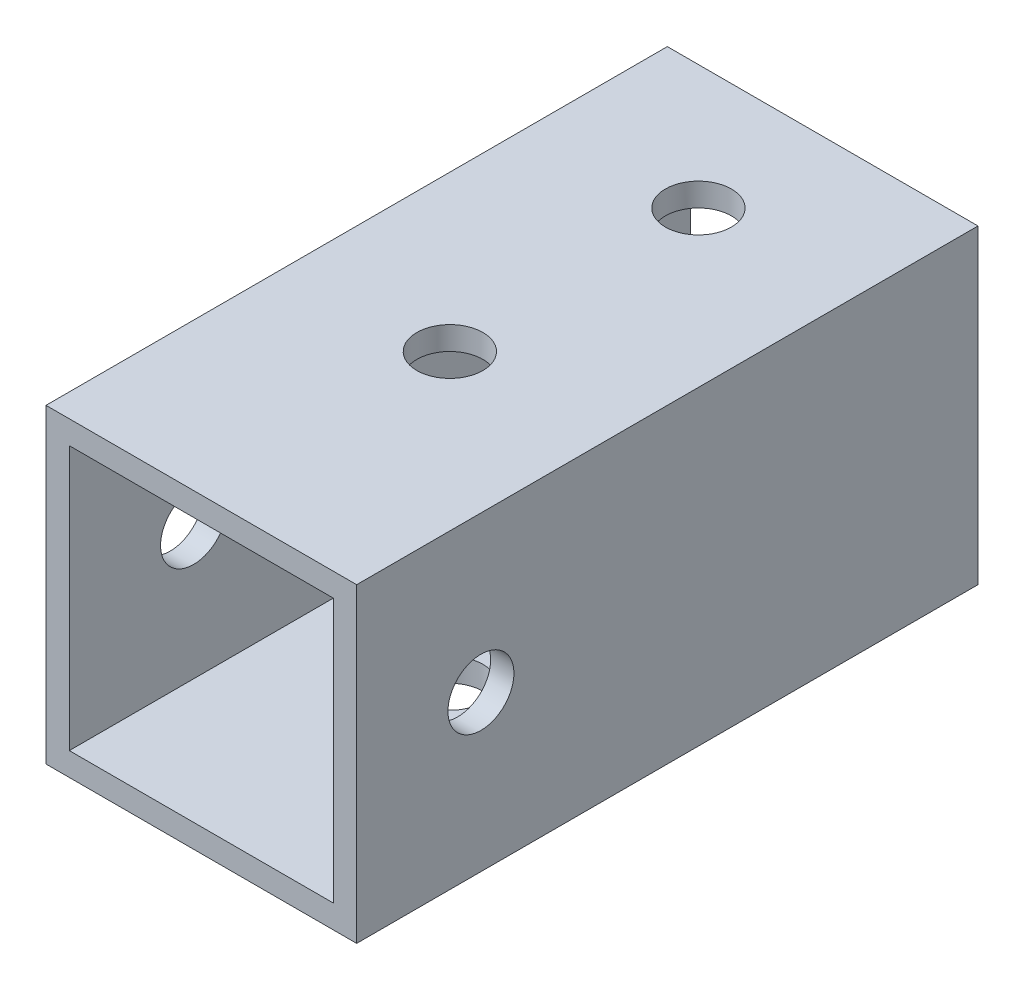
ISO-10303-21;
HEADER;
FILE_DESCRIPTION(('STEP AP214'),'2;1');
FILE_NAME('part.step','',(''),(''),'','','');
FILE_SCHEMA(('AUTOMOTIVE_DESIGN { 1 0 10303 214 1 1 1 1 }'));
ENDSEC;
DATA;
#1=APPLICATION_CONTEXT('core data for automotive mechanical design processes');
#2=APPLICATION_PROTOCOL_DEFINITION('international standard','automotive_design',2000,#1);
#3=PRODUCT_CONTEXT('',#1,'mechanical');
#4=PRODUCT('Part','Part','',(#3));
#5=PRODUCT_RELATED_PRODUCT_CATEGORY('part','',(#4));
#6=PRODUCT_DEFINITION_FORMATION('','',#4);
#7=PRODUCT_DEFINITION_CONTEXT('part definition',#1,'design');
#8=PRODUCT_DEFINITION('design','',#6,#7);
#9=PRODUCT_DEFINITION_SHAPE('','',#8);
#10=(LENGTH_UNIT() NAMED_UNIT(*) SI_UNIT(.MILLI.,.METRE.));
#11=(NAMED_UNIT(*) PLANE_ANGLE_UNIT() SI_UNIT($,.RADIAN.));
#12=(NAMED_UNIT(*) SI_UNIT($,.STERADIAN.) SOLID_ANGLE_UNIT());
#13=UNCERTAINTY_MEASURE_WITH_UNIT(LENGTH_MEASURE(1.E-05),#10,'distance_accuracy_value','');
#14=(GEOMETRIC_REPRESENTATION_CONTEXT(3) GLOBAL_UNCERTAINTY_ASSIGNED_CONTEXT((#13)) GLOBAL_UNIT_ASSIGNED_CONTEXT((#10,
#11,#12)) REPRESENTATION_CONTEXT('',''));
#15=CARTESIAN_POINT('',(0.,0.,0.));
#16=DIRECTION('',(0.,0.,1.));
#17=DIRECTION('',(1.,0.,0.));
#18=AXIS2_PLACEMENT_3D('',#15,#16,#17);
#19=CARTESIAN_POINT('',(10.,-9.99999999999999,-40.));
#20=DIRECTION('',(1.,0.,0.));
#21=DIRECTION('',(0.,0.,-1.));
#22=AXIS2_PLACEMENT_3D('',#19,#20,#21);
#23=PLANE('',#22);
#24=CARTESIAN_POINT('',(10.,0.,-8.));
#25=DIRECTION('',(1.,0.,0.));
#26=DIRECTION('',(0.,0.,-1.));
#27=AXIS2_PLACEMENT_3D('',#24,#25,#26);
#28=CIRCLE('',#27,2.125);
#29=CARTESIAN_POINT('',(10.,0.,-10.125));
#30=VERTEX_POINT('',#29);
#31=EDGE_CURVE('E201',#30,#30,#28,.T.);
#32=ORIENTED_EDGE('',*,*,#31,.F.);
#33=EDGE_LOOP('',(#32));
#34=FACE_BOUND('',#33,.T.);
#35=DIRECTION('',(0.,1.,0.));
#36=VECTOR('',#35,1.);
#37=CARTESIAN_POINT('',(10.,-9.99999999999999,0.));
#38=LINE('',#37,#36);
#39=CARTESIAN_POINT('',(10.,-9.99999999999999,0.));
#40=VERTEX_POINT('',#39);
#41=CARTESIAN_POINT('',(10.,10.,0.));
#42=VERTEX_POINT('',#41);
#43=EDGE_CURVE('E142',#40,#42,#38,.T.);
#44=ORIENTED_EDGE('',*,*,#43,.F.);
#45=DIRECTION('',(0.,0.,1.));
#46=VECTOR('',#45,1.);
#47=CARTESIAN_POINT('',(10.,-9.99999999999999,-40.));
#48=LINE('',#47,#46);
#49=CARTESIAN_POINT('',(10.,-9.99999999999999,-40.));
#50=VERTEX_POINT('',#49);
#51=EDGE_CURVE('E11',#50,#40,#48,.T.);
#52=ORIENTED_EDGE('',*,*,#51,.F.);
#53=DIRECTION('',(0.,1.,0.));
#54=VECTOR('',#53,1.);
#55=CARTESIAN_POINT('',(10.,-9.99999999999999,-40.));
#56=LINE('',#55,#54);
#57=CARTESIAN_POINT('',(10.,10.,-40.));
#58=VERTEX_POINT('',#57);
#59=EDGE_CURVE('E146',#50,#58,#56,.T.);
#60=ORIENTED_EDGE('',*,*,#59,.T.);
#61=DIRECTION('',(0.,0.,1.));
#62=VECTOR('',#61,1.);
#63=CARTESIAN_POINT('',(10.,10.,-40.));
#64=LINE('',#63,#62);
#65=EDGE_CURVE('E159',#58,#42,#64,.T.);
#66=ORIENTED_EDGE('',*,*,#65,.T.);
#67=EDGE_LOOP('',(#44,#52,#60,#66));
#68=FACE_BOUND('',#67,.T.);
#69=ADVANCED_FACE('F41',(#34,#68),#23,.T.);
#70=CARTESIAN_POINT('',(-9.99999999999998,-9.99999999999999,-40.));
#71=DIRECTION('',(0.,-1.,0.));
#72=DIRECTION('',(0.,0.,-1.));
#73=AXIS2_PLACEMENT_3D('',#70,#71,#72);
#74=PLANE('',#73);
#75=CARTESIAN_POINT('',(0.,-9.99999999999999,-16.));
#76=DIRECTION('',(0.,1.,0.));
#77=DIRECTION('',(0.,0.,1.));
#78=AXIS2_PLACEMENT_3D('',#75,#76,#77);
#79=CIRCLE('',#78,2.125);
#80=CARTESIAN_POINT('',(0.,-9.99999999999999,-13.875));
#81=VERTEX_POINT('',#80);
#82=EDGE_CURVE('E177',#81,#81,#79,.T.);
#83=ORIENTED_EDGE('',*,*,#82,.T.);
#84=EDGE_LOOP('',(#83));
#85=FACE_BOUND('',#84,.T.);
#86=CARTESIAN_POINT('',(0.,-9.99999999999999,-32.));
#87=DIRECTION('',(0.,1.,0.));
#88=DIRECTION('',(0.,0.,-1.));
#89=AXIS2_PLACEMENT_3D('',#86,#87,#88);
#90=CIRCLE('',#89,2.125);
#91=CARTESIAN_POINT('',(0.,-9.99999999999999,-34.125));
#92=VERTEX_POINT('',#91);
#93=EDGE_CURVE('E187',#92,#92,#90,.T.);
#94=ORIENTED_EDGE('',*,*,#93,.T.);
#95=EDGE_LOOP('',(#94));
#96=FACE_BOUND('',#95,.T.);
#97=DIRECTION('',(1.,0.,0.));
#98=VECTOR('',#97,1.);
#99=CARTESIAN_POINT('',(-9.99999999999998,-9.99999999999999,0.));
#100=LINE('',#99,#98);
#101=CARTESIAN_POINT('',(-9.99999999999998,-9.99999999999999,0.));
#102=VERTEX_POINT('',#101);
#103=EDGE_CURVE('E150',#102,#40,#100,.T.);
#104=ORIENTED_EDGE('',*,*,#103,.F.);
#105=DIRECTION('',(0.,0.,1.));
#106=VECTOR('',#105,1.);
#107=CARTESIAN_POINT('',(-9.99999999999998,-9.99999999999999,-40.));
#108=LINE('',#107,#106);
#109=CARTESIAN_POINT('',(-9.99999999999998,-9.99999999999999,-40.));
#110=VERTEX_POINT('',#109);
#111=EDGE_CURVE('E49',#110,#102,#108,.T.);
#112=ORIENTED_EDGE('',*,*,#111,.F.);
#113=DIRECTION('',(1.,0.,0.));
#114=VECTOR('',#113,1.);
#115=CARTESIAN_POINT('',(-9.99999999999998,-9.99999999999999,-40.));
#116=LINE('',#115,#114);
#117=EDGE_CURVE('E156',#110,#50,#116,.T.);
#118=ORIENTED_EDGE('',*,*,#117,.T.);
#119=ORIENTED_EDGE('',*,*,#51,.T.);
#120=EDGE_LOOP('',(#104,#112,#118,#119));
#121=FACE_BOUND('',#120,.T.);
#122=ADVANCED_FACE('F230',(#85,#96,#121),#74,.T.);
#123=CARTESIAN_POINT('',(-9.99999999999998,-9.99999999999999,-40.));
#124=DIRECTION('',(-1.,0.,0.));
#125=DIRECTION('',(0.,0.,1.));
#126=AXIS2_PLACEMENT_3D('',#123,#124,#125);
#127=PLANE('',#126);
#128=CARTESIAN_POINT('',(-9.99999999999998,0.,-8.));
#129=DIRECTION('',(1.,0.,0.));
#130=DIRECTION('',(0.,0.,-1.));
#131=AXIS2_PLACEMENT_3D('',#128,#129,#130);
#132=CIRCLE('',#131,2.125);
#133=CARTESIAN_POINT('',(-9.99999999999998,0.,-10.125));
#134=VERTEX_POINT('',#133);
#135=EDGE_CURVE('E204',#134,#134,#132,.T.);
#136=ORIENTED_EDGE('',*,*,#135,.T.);
#137=EDGE_LOOP('',(#136));
#138=FACE_BOUND('',#137,.T.);
#139=DIRECTION('',(0.,-1.,0.));
#140=VECTOR('',#139,1.);
#141=CARTESIAN_POINT('',(-9.99999999999998,-9.99999999999999,0.));
#142=LINE('',#141,#140);
#143=CARTESIAN_POINT('',(-9.99999999999998,10.,0.));
#144=VERTEX_POINT('',#143);
#145=EDGE_CURVE('E165',#144,#102,#142,.T.);
#146=ORIENTED_EDGE('',*,*,#145,.F.);
#147=DIRECTION('',(0.,0.,1.));
#148=VECTOR('',#147,1.);
#149=CARTESIAN_POINT('',(-9.99999999999998,10.,-40.));
#150=LINE('',#149,#148);
#151=CARTESIAN_POINT('',(-9.99999999999998,10.,-40.));
#152=VERTEX_POINT('',#151);
#153=EDGE_CURVE('E171',#152,#144,#150,.T.);
#154=ORIENTED_EDGE('',*,*,#153,.F.);
#155=DIRECTION('',(0.,-1.,0.));
#156=VECTOR('',#155,1.);
#157=CARTESIAN_POINT('',(-9.99999999999998,-9.99999999999999,-40.));
#158=LINE('',#157,#156);
#159=EDGE_CURVE('E153',#152,#110,#158,.T.);
#160=ORIENTED_EDGE('',*,*,#159,.T.);
#161=ORIENTED_EDGE('',*,*,#111,.T.);
#162=EDGE_LOOP('',(#146,#154,#160,#161));
#163=FACE_BOUND('',#162,.T.);
#164=ADVANCED_FACE('F236',(#138,#163),#127,.T.);
#165=CARTESIAN_POINT('',(-9.99999999999998,10.,-40.));
#166=DIRECTION('',(0.,1.,0.));
#167=DIRECTION('',(0.,0.,1.));
#168=AXIS2_PLACEMENT_3D('',#165,#166,#167);
#169=PLANE('',#168);
#170=CARTESIAN_POINT('',(0.,10.,-16.));
#171=DIRECTION('',(0.,1.,0.));
#172=DIRECTION('',(0.,0.,1.));
#173=AXIS2_PLACEMENT_3D('',#170,#171,#172);
#174=CIRCLE('',#173,2.125);
#175=CARTESIAN_POINT('',(0.,10.,-13.875));
#176=VERTEX_POINT('',#175);
#177=EDGE_CURVE('E194',#176,#176,#174,.T.);
#178=ORIENTED_EDGE('',*,*,#177,.F.);
#179=EDGE_LOOP('',(#178));
#180=FACE_BOUND('',#179,.T.);
#181=CARTESIAN_POINT('',(0.,10.,-32.));
#182=DIRECTION('',(0.,1.,0.));
#183=DIRECTION('',(0.,0.,-1.));
#184=AXIS2_PLACEMENT_3D('',#181,#182,#183);
#185=CIRCLE('',#184,2.125);
#186=CARTESIAN_POINT('',(0.,10.,-34.125));
#187=VERTEX_POINT('',#186);
#188=EDGE_CURVE('E190',#187,#187,#185,.T.);
#189=ORIENTED_EDGE('',*,*,#188,.F.);
#190=EDGE_LOOP('',(#189));
#191=FACE_BOUND('',#190,.T.);
#192=DIRECTION('',(-1.,0.,0.));
#193=VECTOR('',#192,1.);
#194=CARTESIAN_POINT('',(-9.99999999999998,10.,0.));
#195=LINE('',#194,#193);
#196=EDGE_CURVE('E162',#42,#144,#195,.T.);
#197=ORIENTED_EDGE('',*,*,#196,.F.);
#198=ORIENTED_EDGE('',*,*,#65,.F.);
#199=DIRECTION('',(-1.,0.,0.));
#200=VECTOR('',#199,1.);
#201=CARTESIAN_POINT('',(-9.99999999999998,10.,-40.));
#202=LINE('',#201,#200);
#203=EDGE_CURVE('E149',#58,#152,#202,.T.);
#204=ORIENTED_EDGE('',*,*,#203,.T.);
#205=ORIENTED_EDGE('',*,*,#153,.T.);
#206=EDGE_LOOP('',(#197,#198,#204,#205));
#207=FACE_BOUND('',#206,.T.);
#208=ADVANCED_FACE('F253',(#180,#191,#207),#169,.T.);
#209=CARTESIAN_POINT('',(0.,0.,-40.));
#210=DIRECTION('',(0.,0.,-1.));
#211=DIRECTION('',(-1.,0.,0.));
#212=AXIS2_PLACEMENT_3D('',#209,#210,#211);
#213=PLANE('',#212);
#214=DIRECTION('',(0.,-1.,0.));
#215=VECTOR('',#214,1.);
#216=CARTESIAN_POINT('',(-8.49999999999998,-8.49999999999999,-40.));
#217=LINE('',#216,#215);
#218=CARTESIAN_POINT('',(-8.49999999999998,8.50000000000002,-40.));
#219=VERTEX_POINT('',#218);
#220=CARTESIAN_POINT('',(-8.49999999999998,-8.49999999999999,-40.));
#221=VERTEX_POINT('',#220);
#222=EDGE_CURVE('E108',#219,#221,#217,.T.);
#223=ORIENTED_EDGE('',*,*,#222,.T.);
#224=DIRECTION('',(1.,0.,0.));
#225=VECTOR('',#224,1.);
#226=CARTESIAN_POINT('',(-8.49999999999998,-8.49999999999999,-40.));
#227=LINE('',#226,#225);
#228=CARTESIAN_POINT('',(8.50000000000002,-8.49999999999999,-40.));
#229=VERTEX_POINT('',#228);
#230=EDGE_CURVE('E117',#221,#229,#227,.T.);
#231=ORIENTED_EDGE('',*,*,#230,.T.);
#232=DIRECTION('',(0.,1.,0.));
#233=VECTOR('',#232,1.);
#234=CARTESIAN_POINT('',(8.50000000000002,-8.49999999999999,-40.));
#235=LINE('',#234,#233);
#236=CARTESIAN_POINT('',(8.50000000000002,8.50000000000002,-40.));
#237=VERTEX_POINT('',#236);
#238=EDGE_CURVE('E57',#229,#237,#235,.T.);
#239=ORIENTED_EDGE('',*,*,#238,.T.);
#240=DIRECTION('',(-1.,0.,0.));
#241=VECTOR('',#240,1.);
#242=CARTESIAN_POINT('',(-8.49999999999998,8.50000000000002,-40.));
#243=LINE('',#242,#241);
#244=EDGE_CURVE('E114',#237,#219,#243,.T.);
#245=ORIENTED_EDGE('',*,*,#244,.T.);
#246=EDGE_LOOP('',(#223,#231,#239,#245));
#247=FACE_BOUND('',#246,.T.);
#248=ORIENTED_EDGE('',*,*,#59,.F.);
#249=ORIENTED_EDGE('',*,*,#117,.F.);
#250=ORIENTED_EDGE('',*,*,#159,.F.);
#251=ORIENTED_EDGE('',*,*,#203,.F.);
#252=EDGE_LOOP('',(#248,#249,#250,#251));
#253=FACE_BOUND('',#252,.T.);
#254=ADVANCED_FACE('F121',(#247,#253),#213,.T.);
#255=CARTESIAN_POINT('',(0.,0.,0.));
#256=DIRECTION('',(0.,0.,-1.));
#257=DIRECTION('',(-1.,0.,0.));
#258=AXIS2_PLACEMENT_3D('',#255,#256,#257);
#259=PLANE('',#258);
#260=DIRECTION('',(1.,0.,0.));
#261=VECTOR('',#260,1.);
#262=CARTESIAN_POINT('',(-8.49999999999998,-8.49999999999999,0.));
#263=LINE('',#262,#261);
#264=CARTESIAN_POINT('',(-8.49999999999998,-8.49999999999999,0.));
#265=VERTEX_POINT('',#264);
#266=CARTESIAN_POINT('',(8.50000000000002,-8.49999999999999,0.));
#267=VERTEX_POINT('',#266);
#268=EDGE_CURVE('E136',#265,#267,#263,.T.);
#269=ORIENTED_EDGE('',*,*,#268,.F.);
#270=DIRECTION('',(0.,-1.,0.));
#271=VECTOR('',#270,1.);
#272=CARTESIAN_POINT('',(-8.49999999999998,-8.49999999999999,0.));
#273=LINE('',#272,#271);
#274=CARTESIAN_POINT('',(-8.49999999999998,8.50000000000002,0.));
#275=VERTEX_POINT('',#274);
#276=EDGE_CURVE('E65',#275,#265,#273,.T.);
#277=ORIENTED_EDGE('',*,*,#276,.F.);
#278=DIRECTION('',(-1.,0.,0.));
#279=VECTOR('',#278,1.);
#280=CARTESIAN_POINT('',(-8.49999999999998,8.50000000000002,0.));
#281=LINE('',#280,#279);
#282=CARTESIAN_POINT('',(8.50000000000002,8.50000000000002,0.));
#283=VERTEX_POINT('',#282);
#284=EDGE_CURVE('E124',#283,#275,#281,.T.);
#285=ORIENTED_EDGE('',*,*,#284,.F.);
#286=DIRECTION('',(0.,1.,0.));
#287=VECTOR('',#286,1.);
#288=CARTESIAN_POINT('',(8.50000000000002,-8.49999999999999,0.));
#289=LINE('',#288,#287);
#290=EDGE_CURVE('E127',#267,#283,#289,.T.);
#291=ORIENTED_EDGE('',*,*,#290,.F.);
#292=EDGE_LOOP('',(#269,#277,#285,#291));
#293=FACE_BOUND('',#292,.T.);
#294=ORIENTED_EDGE('',*,*,#43,.T.);
#295=ORIENTED_EDGE('',*,*,#196,.T.);
#296=ORIENTED_EDGE('',*,*,#145,.T.);
#297=ORIENTED_EDGE('',*,*,#103,.T.);
#298=EDGE_LOOP('',(#294,#295,#296,#297));
#299=FACE_BOUND('',#298,.T.);
#300=ADVANCED_FACE('F246',(#293,#299),#259,.F.);
#301=CARTESIAN_POINT('',(-8.49999999999998,-8.49999999999999,-40.));
#302=DIRECTION('',(-1.,0.,0.));
#303=DIRECTION('',(0.,0.,1.));
#304=AXIS2_PLACEMENT_3D('',#301,#302,#303);
#305=PLANE('',#304);
#306=CARTESIAN_POINT('',(-8.49999999999998,0.,-8.));
#307=DIRECTION('',(-1.,0.,0.));
#308=DIRECTION('',(0.,0.,1.));
#309=AXIS2_PLACEMENT_3D('',#306,#307,#308);
#310=CIRCLE('',#309,2.125);
#311=CARTESIAN_POINT('',(-8.49999999999998,0.,-5.875));
#312=VERTEX_POINT('',#311);
#313=EDGE_CURVE('E191',#312,#312,#310,.T.);
#314=ORIENTED_EDGE('',*,*,#313,.T.);
#315=EDGE_LOOP('',(#314));
#316=FACE_BOUND('',#315,.T.);
#317=ORIENTED_EDGE('',*,*,#276,.T.);
#318=DIRECTION('',(0.,0.,1.));
#319=VECTOR('',#318,1.);
#320=CARTESIAN_POINT('',(-8.49999999999998,-8.49999999999999,-40.));
#321=LINE('',#320,#319);
#322=EDGE_CURVE('E104',#221,#265,#321,.T.);
#323=ORIENTED_EDGE('',*,*,#322,.F.);
#324=ORIENTED_EDGE('',*,*,#222,.F.);
#325=DIRECTION('',(0.,0.,1.));
#326=VECTOR('',#325,1.);
#327=CARTESIAN_POINT('',(-8.49999999999998,8.50000000000002,-40.));
#328=LINE('',#327,#326);
#329=EDGE_CURVE('E140',#219,#275,#328,.T.);
#330=ORIENTED_EDGE('',*,*,#329,.T.);
#331=EDGE_LOOP('',(#317,#323,#324,#330));
#332=FACE_BOUND('',#331,.T.);
#333=ADVANCED_FACE('F106',(#316,#332),#305,.F.);
#334=CARTESIAN_POINT('',(-8.49999999999998,8.50000000000002,-40.));
#335=DIRECTION('',(0.,1.,0.));
#336=DIRECTION('',(0.,0.,1.));
#337=AXIS2_PLACEMENT_3D('',#334,#335,#336);
#338=PLANE('',#337);
#339=CARTESIAN_POINT('',(0.,8.50000000000002,-16.));
#340=DIRECTION('',(0.,1.,0.));
#341=DIRECTION('',(0.,0.,1.));
#342=AXIS2_PLACEMENT_3D('',#339,#340,#341);
#343=CIRCLE('',#342,2.125);
#344=CARTESIAN_POINT('',(0.,8.50000000000002,-13.875));
#345=VERTEX_POINT('',#344);
#346=EDGE_CURVE('E130',#345,#345,#343,.T.);
#347=ORIENTED_EDGE('',*,*,#346,.T.);
#348=EDGE_LOOP('',(#347));
#349=FACE_BOUND('',#348,.T.);
#350=CARTESIAN_POINT('',(0.,8.50000000000002,-32.));
#351=DIRECTION('',(0.,1.,0.));
#352=DIRECTION('',(0.,0.,1.));
#353=AXIS2_PLACEMENT_3D('',#350,#351,#352);
#354=CIRCLE('',#353,2.125);
#355=CARTESIAN_POINT('',(0.,8.50000000000002,-29.875));
#356=VERTEX_POINT('',#355);
#357=EDGE_CURVE('E176',#356,#356,#354,.T.);
#358=ORIENTED_EDGE('',*,*,#357,.T.);
#359=EDGE_LOOP('',(#358));
#360=FACE_BOUND('',#359,.T.);
#361=ORIENTED_EDGE('',*,*,#284,.T.);
#362=ORIENTED_EDGE('',*,*,#329,.F.);
#363=ORIENTED_EDGE('',*,*,#244,.F.);
#364=DIRECTION('',(0.,0.,1.));
#365=VECTOR('',#364,1.);
#366=CARTESIAN_POINT('',(8.50000000000002,8.50000000000002,-40.));
#367=LINE('',#366,#365);
#368=EDGE_CURVE('E143',#237,#283,#367,.T.);
#369=ORIENTED_EDGE('',*,*,#368,.T.);
#370=EDGE_LOOP('',(#361,#362,#363,#369));
#371=FACE_BOUND('',#370,.T.);
#372=ADVANCED_FACE('F268',(#349,#360,#371),#338,.F.);
#373=CARTESIAN_POINT('',(8.50000000000002,-8.49999999999999,-40.));
#374=DIRECTION('',(1.,0.,0.));
#375=DIRECTION('',(0.,0.,-1.));
#376=AXIS2_PLACEMENT_3D('',#373,#374,#375);
#377=PLANE('',#376);
#378=CARTESIAN_POINT('',(8.50000000000003,0.,-8.));
#379=DIRECTION('',(1.,0.,0.));
#380=DIRECTION('',(0.,0.,-1.));
#381=AXIS2_PLACEMENT_3D('',#378,#379,#380);
#382=CIRCLE('',#381,2.125);
#383=CARTESIAN_POINT('',(8.50000000000003,0.,-10.125));
#384=VERTEX_POINT('',#383);
#385=EDGE_CURVE('E44',#384,#384,#382,.T.);
#386=ORIENTED_EDGE('',*,*,#385,.T.);
#387=EDGE_LOOP('',(#386));
#388=FACE_BOUND('',#387,.T.);
#389=ORIENTED_EDGE('',*,*,#290,.T.);
#390=ORIENTED_EDGE('',*,*,#368,.F.);
#391=ORIENTED_EDGE('',*,*,#238,.F.);
#392=DIRECTION('',(0.,0.,1.));
#393=VECTOR('',#392,1.);
#394=CARTESIAN_POINT('',(8.50000000000002,-8.49999999999999,-40.));
#395=LINE('',#394,#393);
#396=EDGE_CURVE('E113',#229,#267,#395,.T.);
#397=ORIENTED_EDGE('',*,*,#396,.T.);
#398=EDGE_LOOP('',(#389,#390,#391,#397));
#399=FACE_BOUND('',#398,.T.);
#400=ADVANCED_FACE('F211',(#388,#399),#377,.F.);
#401=CARTESIAN_POINT('',(-8.49999999999998,-8.49999999999999,-40.));
#402=DIRECTION('',(0.,-1.,0.));
#403=DIRECTION('',(0.,0.,-1.));
#404=AXIS2_PLACEMENT_3D('',#401,#402,#403);
#405=PLANE('',#404);
#406=CARTESIAN_POINT('',(0.,-8.49999999999999,-16.));
#407=DIRECTION('',(0.,-1.,0.));
#408=DIRECTION('',(0.,0.,-1.));
#409=AXIS2_PLACEMENT_3D('',#406,#407,#408);
#410=CIRCLE('',#409,2.125);
#411=CARTESIAN_POINT('',(0.,-8.49999999999999,-18.125));
#412=VERTEX_POINT('',#411);
#413=EDGE_CURVE('E178',#412,#412,#410,.T.);
#414=ORIENTED_EDGE('',*,*,#413,.T.);
#415=EDGE_LOOP('',(#414));
#416=FACE_BOUND('',#415,.T.);
#417=CARTESIAN_POINT('',(0.,-8.49999999999999,-32.));
#418=DIRECTION('',(0.,-1.,0.));
#419=DIRECTION('',(0.,0.,-1.));
#420=AXIS2_PLACEMENT_3D('',#417,#418,#419);
#421=CIRCLE('',#420,2.125);
#422=CARTESIAN_POINT('',(0.,-8.49999999999999,-34.125));
#423=VERTEX_POINT('',#422);
#424=EDGE_CURVE('E174',#423,#423,#421,.T.);
#425=ORIENTED_EDGE('',*,*,#424,.T.);
#426=EDGE_LOOP('',(#425));
#427=FACE_BOUND('',#426,.T.);
#428=ORIENTED_EDGE('',*,*,#268,.T.);
#429=ORIENTED_EDGE('',*,*,#396,.F.);
#430=ORIENTED_EDGE('',*,*,#230,.F.);
#431=ORIENTED_EDGE('',*,*,#322,.T.);
#432=EDGE_LOOP('',(#428,#429,#430,#431));
#433=FACE_BOUND('',#432,.T.);
#434=ADVANCED_FACE('F118',(#416,#427,#433),#405,.F.);
#435=CARTESIAN_POINT('',(0.,-9.99999999999999,-32.));
#436=DIRECTION('',(0.,1.,0.));
#437=DIRECTION('',(0.,0.,1.));
#438=AXIS2_PLACEMENT_3D('',#435,#436,#437);
#439=CYLINDRICAL_SURFACE('',#438,2.125);
#440=ORIENTED_EDGE('',*,*,#93,.F.);
#441=EDGE_LOOP('',(#440));
#442=FACE_BOUND('',#441,.T.);
#443=ORIENTED_EDGE('',*,*,#424,.F.);
#444=EDGE_LOOP('',(#443));
#445=FACE_BOUND('',#444,.T.);
#446=ADVANCED_FACE('F272',(#442,#445),#439,.F.);
#447=CARTESIAN_POINT('',(0.,-9.99999999999999,-16.));
#448=DIRECTION('',(0.,1.,0.));
#449=DIRECTION('',(0.,0.,1.));
#450=AXIS2_PLACEMENT_3D('',#447,#448,#449);
#451=CYLINDRICAL_SURFACE('',#450,2.125);
#452=ORIENTED_EDGE('',*,*,#82,.F.);
#453=EDGE_LOOP('',(#452));
#454=FACE_BOUND('',#453,.T.);
#455=ORIENTED_EDGE('',*,*,#413,.F.);
#456=EDGE_LOOP('',(#455));
#457=FACE_BOUND('',#456,.T.);
#458=ADVANCED_FACE('F228',(#454,#457),#451,.F.);
#459=ORIENTED_EDGE('',*,*,#188,.T.);
#460=EDGE_LOOP('',(#459));
#461=FACE_BOUND('',#460,.T.);
#462=ORIENTED_EDGE('',*,*,#357,.F.);
#463=EDGE_LOOP('',(#462));
#464=FACE_BOUND('',#463,.T.);
#465=ADVANCED_FACE('F225',(#461,#464),#439,.F.);
#466=ORIENTED_EDGE('',*,*,#177,.T.);
#467=EDGE_LOOP('',(#466));
#468=FACE_BOUND('',#467,.T.);
#469=ORIENTED_EDGE('',*,*,#346,.F.);
#470=EDGE_LOOP('',(#469));
#471=FACE_BOUND('',#470,.T.);
#472=ADVANCED_FACE('F216',(#468,#471),#451,.F.);
#473=CARTESIAN_POINT('',(-9.99999999999998,0.,-8.));
#474=DIRECTION('',(1.,0.,0.));
#475=DIRECTION('',(0.,0.,-1.));
#476=AXIS2_PLACEMENT_3D('',#473,#474,#475);
#477=CYLINDRICAL_SURFACE('',#476,2.125);
#478=ORIENTED_EDGE('',*,*,#31,.T.);
#479=EDGE_LOOP('',(#478));
#480=FACE_BOUND('',#479,.T.);
#481=ORIENTED_EDGE('',*,*,#385,.F.);
#482=EDGE_LOOP('',(#481));
#483=FACE_BOUND('',#482,.T.);
#484=ADVANCED_FACE('F213',(#480,#483),#477,.F.);
#485=ORIENTED_EDGE('',*,*,#135,.F.);
#486=EDGE_LOOP('',(#485));
#487=FACE_BOUND('',#486,.T.);
#488=ORIENTED_EDGE('',*,*,#313,.F.);
#489=EDGE_LOOP('',(#488));
#490=FACE_BOUND('',#489,.T.);
#491=ADVANCED_FACE('F215',(#487,#490),#477,.F.);
#492=CLOSED_SHELL('',(#69,#122,#164,#208,#254,#300,#333,#372,#400,#434,#446,#458,#465,#472,#484,#491));
#493=MANIFOLD_SOLID_BREP('B2',#492);
#494=ADVANCED_BREP_SHAPE_REPRESENTATION('',(#18,#493),#14);
#495=SHAPE_DEFINITION_REPRESENTATION(#9,#494);
ENDSEC;
END-ISO-10303-21;
